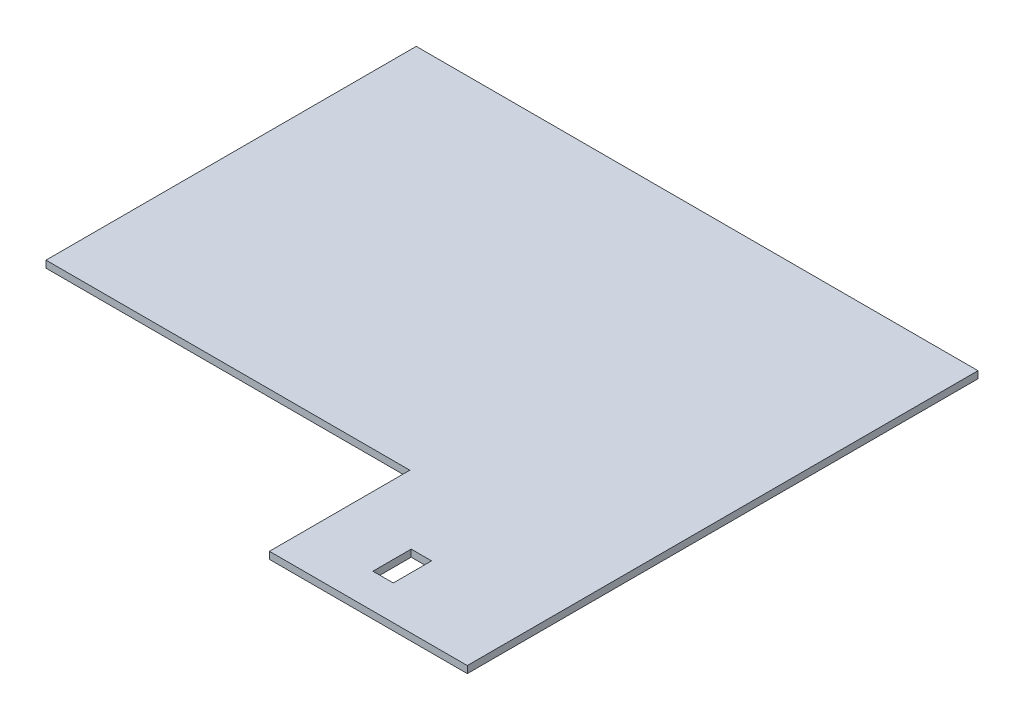
ISO-10303-21;
HEADER;
FILE_DESCRIPTION(('STEP AP214'),'2;1');
FILE_NAME('part.step','',(''),(''),'','','');
FILE_SCHEMA(('AUTOMOTIVE_DESIGN { 1 0 10303 214 1 1 1 1 }'));
ENDSEC;
DATA;
#1=APPLICATION_CONTEXT('core data for automotive mechanical design processes');
#2=APPLICATION_PROTOCOL_DEFINITION('international standard','automotive_design',2000,#1);
#3=PRODUCT_CONTEXT('',#1,'mechanical');
#4=PRODUCT('Part','Part','',(#3));
#5=PRODUCT_RELATED_PRODUCT_CATEGORY('part','',(#4));
#6=PRODUCT_DEFINITION_FORMATION('','',#4);
#7=PRODUCT_DEFINITION_CONTEXT('part definition',#1,'design');
#8=PRODUCT_DEFINITION('design','',#6,#7);
#9=PRODUCT_DEFINITION_SHAPE('','',#8);
#10=(LENGTH_UNIT() NAMED_UNIT(*) SI_UNIT(.MILLI.,.METRE.));
#11=(NAMED_UNIT(*) PLANE_ANGLE_UNIT() SI_UNIT($,.RADIAN.));
#12=(NAMED_UNIT(*) SI_UNIT($,.STERADIAN.) SOLID_ANGLE_UNIT());
#13=UNCERTAINTY_MEASURE_WITH_UNIT(LENGTH_MEASURE(1.E-05),#10,'distance_accuracy_value','');
#14=(GEOMETRIC_REPRESENTATION_CONTEXT(3) GLOBAL_UNCERTAINTY_ASSIGNED_CONTEXT((#13)) GLOBAL_UNIT_ASSIGNED_CONTEXT((#10,
#11,#12)) REPRESENTATION_CONTEXT('',''));
#15=CARTESIAN_POINT('',(0.,0.,0.));
#16=DIRECTION('',(0.,0.,1.));
#17=DIRECTION('',(1.,0.,0.));
#18=AXIS2_PLACEMENT_3D('',#15,#16,#17);
#19=CARTESIAN_POINT('',(127.62527392326,5.5,0.));
#20=DIRECTION('',(-1.,0.,0.));
#21=DIRECTION('',(0.,0.,1.));
#22=AXIS2_PLACEMENT_3D('',#19,#20,#21);
#23=PLANE('',#22);
#24=DIRECTION('',(0.,0.,-1.));
#25=VECTOR('',#24,1.);
#26=CARTESIAN_POINT('',(127.62527392326,0.,0.));
#27=LINE('',#26,#25);
#28=CARTESIAN_POINT('',(127.62527392326,0.,375.295789036028));
#29=VERTEX_POINT('',#28);
#30=CARTESIAN_POINT('',(127.62527392326,0.,345.295789036028));
#31=VERTEX_POINT('',#30);
#32=EDGE_CURVE('E155',#29,#31,#27,.T.);
#33=ORIENTED_EDGE('',*,*,#32,.T.);
#34=DIRECTION('',(0.,-1.,0.));
#35=VECTOR('',#34,1.);
#36=CARTESIAN_POINT('',(127.62527392326,5.5,345.295789036028));
#37=LINE('',#36,#35);
#38=CARTESIAN_POINT('',(127.62527392326,5.5,345.295789036028));
#39=VERTEX_POINT('',#38);
#40=EDGE_CURVE('E11',#39,#31,#37,.T.);
#41=ORIENTED_EDGE('',*,*,#40,.F.);
#42=DIRECTION('',(0.,0.,-1.));
#43=VECTOR('',#42,1.);
#44=CARTESIAN_POINT('',(127.62527392326,5.5,0.));
#45=LINE('',#44,#43);
#46=CARTESIAN_POINT('',(127.62527392326,5.5,375.295789036028));
#47=VERTEX_POINT('',#46);
#48=EDGE_CURVE('E125',#47,#39,#45,.T.);
#49=ORIENTED_EDGE('',*,*,#48,.F.);
#50=DIRECTION('',(0.,-1.,0.));
#51=VECTOR('',#50,1.);
#52=CARTESIAN_POINT('',(127.62527392326,5.5,375.295789036028));
#53=LINE('',#52,#51);
#54=EDGE_CURVE('E162',#47,#29,#53,.T.);
#55=ORIENTED_EDGE('',*,*,#54,.T.);
#56=EDGE_LOOP('',(#33,#41,#49,#55));
#57=FACE_BOUND('',#56,.T.);
#58=ADVANCED_FACE('F32',(#57),#23,.F.);
#59=CARTESIAN_POINT('',(0.,5.5,345.295789036028));
#60=DIRECTION('',(0.,0.,-1.));
#61=DIRECTION('',(-1.,0.,0.));
#62=AXIS2_PLACEMENT_3D('',#59,#60,#61);
#63=PLANE('',#62);
#64=DIRECTION('',(1.,0.,0.));
#65=VECTOR('',#64,1.);
#66=CARTESIAN_POINT('',(0.,0.,345.295789036028));
#67=LINE('',#66,#65);
#68=CARTESIAN_POINT('',(143.58670680185,0.,345.295789036028));
#69=VERTEX_POINT('',#68);
#70=EDGE_CURVE('E130',#31,#69,#67,.T.);
#71=ORIENTED_EDGE('',*,*,#70,.T.);
#72=DIRECTION('',(0.,-1.,0.));
#73=VECTOR('',#72,1.);
#74=CARTESIAN_POINT('',(143.58670680185,5.5,345.295789036028));
#75=LINE('',#74,#73);
#76=CARTESIAN_POINT('',(143.58670680185,5.5,345.295789036028));
#77=VERTEX_POINT('',#76);
#78=EDGE_CURVE('E42',#77,#69,#75,.T.);
#79=ORIENTED_EDGE('',*,*,#78,.F.);
#80=DIRECTION('',(1.,0.,0.));
#81=VECTOR('',#80,1.);
#82=CARTESIAN_POINT('',(0.,5.5,345.295789036028));
#83=LINE('',#82,#81);
#84=EDGE_CURVE('E119',#39,#77,#83,.T.);
#85=ORIENTED_EDGE('',*,*,#84,.F.);
#86=ORIENTED_EDGE('',*,*,#40,.T.);
#87=EDGE_LOOP('',(#71,#79,#85,#86));
#88=FACE_BOUND('',#87,.T.);
#89=ADVANCED_FACE('F129',(#88),#63,.F.);
#90=CARTESIAN_POINT('',(143.58670680185,5.5,0.));
#91=DIRECTION('',(1.,0.,0.));
#92=DIRECTION('',(0.,0.,-1.));
#93=AXIS2_PLACEMENT_3D('',#90,#91,#92);
#94=PLANE('',#93);
#95=DIRECTION('',(0.,0.,1.));
#96=VECTOR('',#95,1.);
#97=CARTESIAN_POINT('',(143.58670680185,0.,0.));
#98=LINE('',#97,#96);
#99=CARTESIAN_POINT('',(143.58670680185,0.,375.295789036028));
#100=VERTEX_POINT('',#99);
#101=EDGE_CURVE('E86',#69,#100,#98,.T.);
#102=ORIENTED_EDGE('',*,*,#101,.T.);
#103=DIRECTION('',(0.,-1.,0.));
#104=VECTOR('',#103,1.);
#105=CARTESIAN_POINT('',(143.58670680185,5.5,375.295789036028));
#106=LINE('',#105,#104);
#107=CARTESIAN_POINT('',(143.58670680185,5.5,375.295789036028));
#108=VERTEX_POINT('',#107);
#109=EDGE_CURVE('E131',#108,#100,#106,.T.);
#110=ORIENTED_EDGE('',*,*,#109,.F.);
#111=DIRECTION('',(0.,0.,1.));
#112=VECTOR('',#111,1.);
#113=CARTESIAN_POINT('',(143.58670680185,5.5,0.));
#114=LINE('',#113,#112);
#115=EDGE_CURVE('E123',#77,#108,#114,.T.);
#116=ORIENTED_EDGE('',*,*,#115,.F.);
#117=ORIENTED_EDGE('',*,*,#78,.T.);
#118=EDGE_LOOP('',(#102,#110,#116,#117));
#119=FACE_BOUND('',#118,.T.);
#120=ADVANCED_FACE('F133',(#119),#94,.F.);
#121=CARTESIAN_POINT('',(73.5867068018496,5.5,0.));
#122=DIRECTION('',(-1.,0.,0.));
#123=DIRECTION('',(0.,0.,1.));
#124=AXIS2_PLACEMENT_3D('',#121,#122,#123);
#125=PLANE('',#124);
#126=DIRECTION('',(0.,0.,-1.));
#127=VECTOR('',#126,1.);
#128=CARTESIAN_POINT('',(73.5867068018496,0.,0.));
#129=LINE('',#128,#127);
#130=CARTESIAN_POINT('',(73.5867068018496,0.,402.295789036028));
#131=VERTEX_POINT('',#130);
#132=CARTESIAN_POINT('',(73.5867068018496,0.,292.295789036028));
#133=VERTEX_POINT('',#132);
#134=EDGE_CURVE('E139',#131,#133,#129,.T.);
#135=ORIENTED_EDGE('',*,*,#134,.F.);
#136=DIRECTION('',(0.,-1.,0.));
#137=VECTOR('',#136,1.);
#138=CARTESIAN_POINT('',(73.5867068018496,5.5,402.295789036028));
#139=LINE('',#138,#137);
#140=CARTESIAN_POINT('',(73.5867068018496,5.5,402.295789036028));
#141=VERTEX_POINT('',#140);
#142=EDGE_CURVE('E36',#141,#131,#139,.T.);
#143=ORIENTED_EDGE('',*,*,#142,.F.);
#144=DIRECTION('',(0.,0.,-1.));
#145=VECTOR('',#144,1.);
#146=CARTESIAN_POINT('',(73.5867068018496,5.5,0.));
#147=LINE('',#146,#145);
#148=CARTESIAN_POINT('',(73.5867068018496,5.5,292.295789036028));
#149=VERTEX_POINT('',#148);
#150=EDGE_CURVE('E161',#141,#149,#147,.T.);
#151=ORIENTED_EDGE('',*,*,#150,.T.);
#152=DIRECTION('',(0.,-1.,0.));
#153=VECTOR('',#152,1.);
#154=CARTESIAN_POINT('',(73.5867068018496,5.5,292.295789036028));
#155=LINE('',#154,#153);
#156=EDGE_CURVE('E135',#149,#133,#155,.T.);
#157=ORIENTED_EDGE('',*,*,#156,.T.);
#158=EDGE_LOOP('',(#135,#143,#151,#157));
#159=FACE_BOUND('',#158,.T.);
#160=ADVANCED_FACE('F34',(#159),#125,.T.);
#161=CARTESIAN_POINT('',(0.,5.5,402.295789036028));
#162=DIRECTION('',(0.,0.,1.));
#163=DIRECTION('',(1.,0.,0.));
#164=AXIS2_PLACEMENT_3D('',#161,#162,#163);
#165=PLANE('',#164);
#166=DIRECTION('',(-1.,0.,0.));
#167=VECTOR('',#166,1.);
#168=CARTESIAN_POINT('',(0.,0.,402.295789036028));
#169=LINE('',#168,#167);
#170=CARTESIAN_POINT('',(228.58670680185,0.,402.295789036028));
#171=VERTEX_POINT('',#170);
#172=EDGE_CURVE('E142',#171,#131,#169,.T.);
#173=ORIENTED_EDGE('',*,*,#172,.F.);
#174=DIRECTION('',(0.,-1.,0.));
#175=VECTOR('',#174,1.);
#176=CARTESIAN_POINT('',(228.58670680185,5.5,402.295789036028));
#177=LINE('',#176,#175);
#178=CARTESIAN_POINT('',(228.58670680185,5.5,402.295789036028));
#179=VERTEX_POINT('',#178);
#180=EDGE_CURVE('E173',#179,#171,#177,.T.);
#181=ORIENTED_EDGE('',*,*,#180,.F.);
#182=DIRECTION('',(-1.,0.,0.));
#183=VECTOR('',#182,1.);
#184=CARTESIAN_POINT('',(0.,5.5,402.295789036028));
#185=LINE('',#184,#183);
#186=EDGE_CURVE('E182',#179,#141,#185,.T.);
#187=ORIENTED_EDGE('',*,*,#186,.T.);
#188=ORIENTED_EDGE('',*,*,#142,.T.);
#189=EDGE_LOOP('',(#173,#181,#187,#188));
#190=FACE_BOUND('',#189,.T.);
#191=ADVANCED_FACE('F180',(#190),#165,.T.);
#192=CARTESIAN_POINT('',(228.58670680185,5.5,0.));
#193=DIRECTION('',(1.,0.,0.));
#194=DIRECTION('',(0.,0.,-1.));
#195=AXIS2_PLACEMENT_3D('',#192,#193,#194);
#196=PLANE('',#195);
#197=DIRECTION('',(0.,0.,1.));
#198=VECTOR('',#197,1.);
#199=CARTESIAN_POINT('',(228.58670680185,0.,0.));
#200=LINE('',#199,#198);
#201=CARTESIAN_POINT('',(228.58670680185,0.,2.29578903602801));
#202=VERTEX_POINT('',#201);
#203=EDGE_CURVE('E145',#202,#171,#200,.T.);
#204=ORIENTED_EDGE('',*,*,#203,.F.);
#205=DIRECTION('',(0.,-1.,0.));
#206=VECTOR('',#205,1.);
#207=CARTESIAN_POINT('',(228.58670680185,5.5,2.29578903602801));
#208=LINE('',#207,#206);
#209=CARTESIAN_POINT('',(228.58670680185,5.5,2.29578903602801));
#210=VERTEX_POINT('',#209);
#211=EDGE_CURVE('E172',#210,#202,#208,.T.);
#212=ORIENTED_EDGE('',*,*,#211,.F.);
#213=DIRECTION('',(0.,0.,1.));
#214=VECTOR('',#213,1.);
#215=CARTESIAN_POINT('',(228.58670680185,5.5,0.));
#216=LINE('',#215,#214);
#217=EDGE_CURVE('E193',#210,#179,#216,.T.);
#218=ORIENTED_EDGE('',*,*,#217,.T.);
#219=ORIENTED_EDGE('',*,*,#180,.T.);
#220=EDGE_LOOP('',(#204,#212,#218,#219));
#221=FACE_BOUND('',#220,.T.);
#222=ADVANCED_FACE('F190',(#221),#196,.T.);
#223=CARTESIAN_POINT('',(0.,5.5,2.29578903602801));
#224=DIRECTION('',(0.,0.,1.));
#225=DIRECTION('',(1.,0.,0.));
#226=AXIS2_PLACEMENT_3D('',#223,#224,#225);
#227=PLANE('',#226);
#228=DIRECTION('',(-1.,0.,0.));
#229=VECTOR('',#228,1.);
#230=CARTESIAN_POINT('',(0.,0.,2.29578903602801));
#231=LINE('',#230,#229);
#232=CARTESIAN_POINT('',(-211.41329319815,0.,2.29578903602801));
#233=VERTEX_POINT('',#232);
#234=EDGE_CURVE('E148',#202,#233,#231,.T.);
#235=ORIENTED_EDGE('',*,*,#234,.T.);
#236=DIRECTION('',(0.,-1.,0.));
#237=VECTOR('',#236,1.);
#238=CARTESIAN_POINT('',(-211.41329319815,5.5,2.29578903602801));
#239=LINE('',#238,#237);
#240=CARTESIAN_POINT('',(-211.41329319815,5.5,2.29578903602801));
#241=VERTEX_POINT('',#240);
#242=EDGE_CURVE('E169',#241,#233,#239,.T.);
#243=ORIENTED_EDGE('',*,*,#242,.F.);
#244=DIRECTION('',(-1.,0.,0.));
#245=VECTOR('',#244,1.);
#246=CARTESIAN_POINT('',(0.,5.5,2.29578903602801));
#247=LINE('',#246,#245);
#248=EDGE_CURVE('E196',#210,#241,#247,.T.);
#249=ORIENTED_EDGE('',*,*,#248,.F.);
#250=ORIENTED_EDGE('',*,*,#211,.T.);
#251=EDGE_LOOP('',(#235,#243,#249,#250));
#252=FACE_BOUND('',#251,.T.);
#253=ADVANCED_FACE('F197',(#252),#227,.F.);
#254=CARTESIAN_POINT('',(-211.41329319815,5.5,0.));
#255=DIRECTION('',(1.,0.,0.));
#256=DIRECTION('',(0.,0.,-1.));
#257=AXIS2_PLACEMENT_3D('',#254,#255,#256);
#258=PLANE('',#257);
#259=DIRECTION('',(0.,0.,1.));
#260=VECTOR('',#259,1.);
#261=CARTESIAN_POINT('',(-211.41329319815,0.,0.));
#262=LINE('',#261,#260);
#263=CARTESIAN_POINT('',(-211.41329319815,0.,292.295789036028));
#264=VERTEX_POINT('',#263);
#265=EDGE_CURVE('E150',#233,#264,#262,.T.);
#266=ORIENTED_EDGE('',*,*,#265,.T.);
#267=DIRECTION('',(0.,-1.,0.));
#268=VECTOR('',#267,1.);
#269=CARTESIAN_POINT('',(-211.41329319815,5.5,292.295789036028));
#270=LINE('',#269,#268);
#271=CARTESIAN_POINT('',(-211.41329319815,5.5,292.295789036028));
#272=VERTEX_POINT('',#271);
#273=EDGE_CURVE('E166',#272,#264,#270,.T.);
#274=ORIENTED_EDGE('',*,*,#273,.F.);
#275=DIRECTION('',(0.,0.,1.));
#276=VECTOR('',#275,1.);
#277=CARTESIAN_POINT('',(-211.41329319815,5.5,0.));
#278=LINE('',#277,#276);
#279=EDGE_CURVE('E200',#241,#272,#278,.T.);
#280=ORIENTED_EDGE('',*,*,#279,.F.);
#281=ORIENTED_EDGE('',*,*,#242,.T.);
#282=EDGE_LOOP('',(#266,#274,#280,#281));
#283=FACE_BOUND('',#282,.T.);
#284=ADVANCED_FACE('F213',(#283),#258,.F.);
#285=CARTESIAN_POINT('',(-1.13864391224132E-13,5.5,292.295789036028));
#286=DIRECTION('',(0.,0.,-1.));
#287=DIRECTION('',(-1.,0.,0.));
#288=AXIS2_PLACEMENT_3D('',#285,#286,#287);
#289=PLANE('',#288);
#290=DIRECTION('',(1.,0.,0.));
#291=VECTOR('',#290,1.);
#292=CARTESIAN_POINT('',(-1.13864391224132E-13,0.,292.295789036028));
#293=LINE('',#292,#291);
#294=EDGE_CURVE('E152',#264,#133,#293,.T.);
#295=ORIENTED_EDGE('',*,*,#294,.T.);
#296=ORIENTED_EDGE('',*,*,#156,.F.);
#297=DIRECTION('',(1.,0.,0.));
#298=VECTOR('',#297,1.);
#299=CARTESIAN_POINT('',(-1.13864391224132E-13,5.5,292.295789036028));
#300=LINE('',#299,#298);
#301=EDGE_CURVE('E207',#272,#149,#300,.T.);
#302=ORIENTED_EDGE('',*,*,#301,.F.);
#303=ORIENTED_EDGE('',*,*,#273,.T.);
#304=EDGE_LOOP('',(#295,#296,#302,#303));
#305=FACE_BOUND('',#304,.T.);
#306=ADVANCED_FACE('F211',(#305),#289,.F.);
#307=CARTESIAN_POINT('',(0.,5.5,375.295789036028));
#308=DIRECTION('',(0.,0.,1.));
#309=DIRECTION('',(1.,0.,0.));
#310=AXIS2_PLACEMENT_3D('',#307,#308,#309);
#311=PLANE('',#310);
#312=DIRECTION('',(-1.,0.,0.));
#313=VECTOR('',#312,1.);
#314=CARTESIAN_POINT('',(0.,0.,375.295789036028));
#315=LINE('',#314,#313);
#316=EDGE_CURVE('E92',#100,#29,#315,.T.);
#317=ORIENTED_EDGE('',*,*,#316,.T.);
#318=ORIENTED_EDGE('',*,*,#54,.F.);
#319=DIRECTION('',(-1.,0.,0.));
#320=VECTOR('',#319,1.);
#321=CARTESIAN_POINT('',(0.,5.5,375.295789036028));
#322=LINE('',#321,#320);
#323=EDGE_CURVE('E51',#108,#47,#322,.T.);
#324=ORIENTED_EDGE('',*,*,#323,.F.);
#325=ORIENTED_EDGE('',*,*,#109,.T.);
#326=EDGE_LOOP('',(#317,#318,#324,#325));
#327=FACE_BOUND('',#326,.T.);
#328=ADVANCED_FACE('F220',(#327),#311,.F.);
#329=CARTESIAN_POINT('',(0.,5.5,0.));
#330=DIRECTION('',(0.,1.,0.));
#331=DIRECTION('',(0.,0.,1.));
#332=AXIS2_PLACEMENT_3D('',#329,#330,#331);
#333=PLANE('',#332);
#334=ORIENTED_EDGE('',*,*,#150,.F.);
#335=ORIENTED_EDGE('',*,*,#186,.F.);
#336=ORIENTED_EDGE('',*,*,#217,.F.);
#337=ORIENTED_EDGE('',*,*,#248,.T.);
#338=ORIENTED_EDGE('',*,*,#279,.T.);
#339=ORIENTED_EDGE('',*,*,#301,.T.);
#340=EDGE_LOOP('',(#334,#335,#336,#337,#338,#339));
#341=FACE_BOUND('',#340,.T.);
#342=ORIENTED_EDGE('',*,*,#48,.T.);
#343=ORIENTED_EDGE('',*,*,#84,.T.);
#344=ORIENTED_EDGE('',*,*,#115,.T.);
#345=ORIENTED_EDGE('',*,*,#323,.T.);
#346=EDGE_LOOP('',(#342,#343,#344,#345));
#347=FACE_BOUND('',#346,.T.);
#348=ADVANCED_FACE('F121',(#341,#347),#333,.T.);
#349=CARTESIAN_POINT('',(0.,0.,0.));
#350=DIRECTION('',(0.,1.,0.));
#351=DIRECTION('',(0.,0.,1.));
#352=AXIS2_PLACEMENT_3D('',#349,#350,#351);
#353=PLANE('',#352);
#354=ORIENTED_EDGE('',*,*,#134,.T.);
#355=ORIENTED_EDGE('',*,*,#294,.F.);
#356=ORIENTED_EDGE('',*,*,#265,.F.);
#357=ORIENTED_EDGE('',*,*,#234,.F.);
#358=ORIENTED_EDGE('',*,*,#203,.T.);
#359=ORIENTED_EDGE('',*,*,#172,.T.);
#360=EDGE_LOOP('',(#354,#355,#356,#357,#358,#359));
#361=FACE_BOUND('',#360,.T.);
#362=ORIENTED_EDGE('',*,*,#32,.F.);
#363=ORIENTED_EDGE('',*,*,#316,.F.);
#364=ORIENTED_EDGE('',*,*,#101,.F.);
#365=ORIENTED_EDGE('',*,*,#70,.F.);
#366=EDGE_LOOP('',(#362,#363,#364,#365));
#367=FACE_BOUND('',#366,.T.);
#368=ADVANCED_FACE('F186',(#361,#367),#353,.F.);
#369=CLOSED_SHELL('',(#58,#89,#120,#160,#191,#222,#253,#284,#306,#328,#348,#368));
#370=MANIFOLD_SOLID_BREP('B2',#369);
#371=ADVANCED_BREP_SHAPE_REPRESENTATION('',(#18,#370),#14);
#372=SHAPE_DEFINITION_REPRESENTATION(#9,#371);
ENDSEC;
END-ISO-10303-21;
